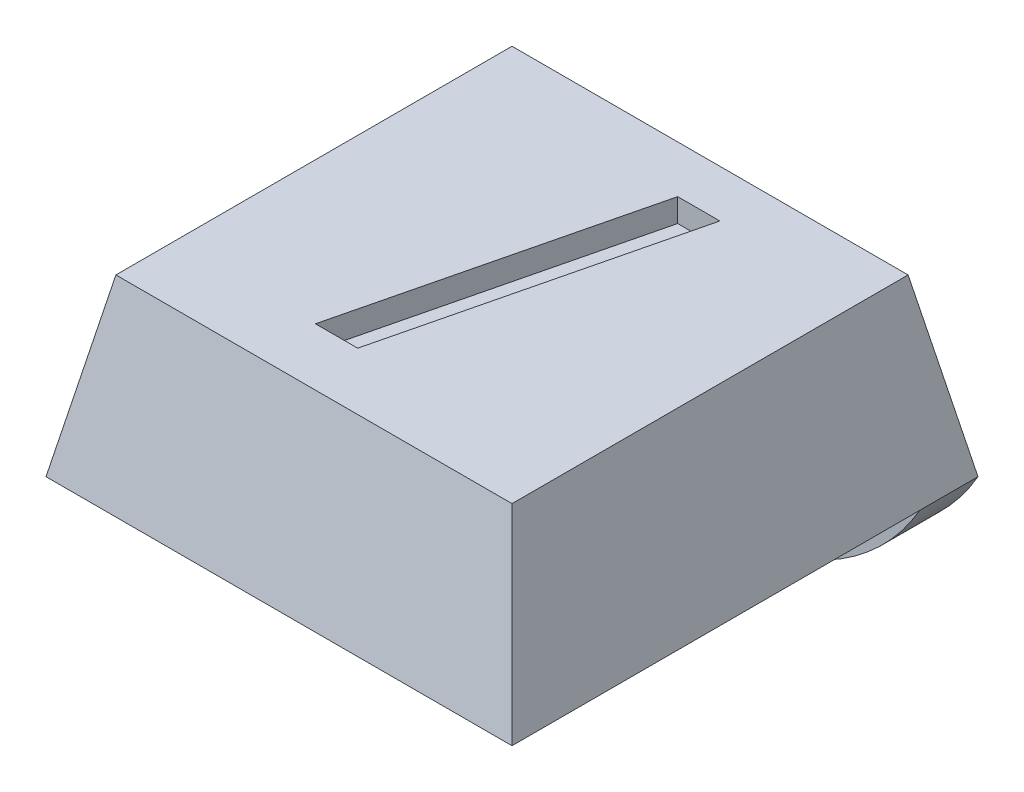
ISO-10303-21;
HEADER;
FILE_DESCRIPTION(('STEP AP214'),'2;1');
FILE_NAME('part.step','',(''),(''),'','','');
FILE_SCHEMA(('AUTOMOTIVE_DESIGN { 1 0 10303 214 1 1 1 1 }'));
ENDSEC;
DATA;
#1=APPLICATION_CONTEXT('core data for automotive mechanical design processes');
#2=APPLICATION_PROTOCOL_DEFINITION('international standard','automotive_design',2000,#1);
#3=PRODUCT_CONTEXT('',#1,'mechanical');
#4=PRODUCT('Part','Part','',(#3));
#5=PRODUCT_RELATED_PRODUCT_CATEGORY('part','',(#4));
#6=PRODUCT_DEFINITION_FORMATION('','',#4);
#7=PRODUCT_DEFINITION_CONTEXT('part definition',#1,'design');
#8=PRODUCT_DEFINITION('design','',#6,#7);
#9=PRODUCT_DEFINITION_SHAPE('','',#8);
#10=(LENGTH_UNIT() NAMED_UNIT(*) SI_UNIT(.MILLI.,.METRE.));
#11=(NAMED_UNIT(*) PLANE_ANGLE_UNIT() SI_UNIT($,.RADIAN.));
#12=(NAMED_UNIT(*) SI_UNIT($,.STERADIAN.) SOLID_ANGLE_UNIT());
#13=UNCERTAINTY_MEASURE_WITH_UNIT(LENGTH_MEASURE(1.E-05),#10,'distance_accuracy_value','');
#14=(GEOMETRIC_REPRESENTATION_CONTEXT(3) GLOBAL_UNCERTAINTY_ASSIGNED_CONTEXT((#13)) GLOBAL_UNIT_ASSIGNED_CONTEXT((#10,
#11,#12)) REPRESENTATION_CONTEXT('',''));
#15=CARTESIAN_POINT('',(0.,0.,0.));
#16=DIRECTION('',(0.,0.,1.));
#17=DIRECTION('',(1.,0.,0.));
#18=AXIS2_PLACEMENT_3D('',#15,#16,#17);
#19=CARTESIAN_POINT('',(0.,3.,0.));
#20=DIRECTION('',(0.,-1.,0.));
#21=DIRECTION('',(0.,0.,-1.));
#22=AXIS2_PLACEMENT_3D('',#19,#20,#21);
#23=PLANE('',#22);
#24=DIRECTION('',(-1.,0.,0.));
#25=VECTOR('',#24,1.);
#26=CARTESIAN_POINT('',(11.,3.,-0.6));
#27=LINE('',#26,#25);
#28=CARTESIAN_POINT('',(7.4,3.,-0.6));
#29=VERTEX_POINT('',#28);
#30=CARTESIAN_POINT('',(0.6,3.,-0.6));
#31=VERTEX_POINT('',#30);
#32=EDGE_CURVE('E181',#29,#31,#27,.T.);
#33=ORIENTED_EDGE('',*,*,#32,.F.);
#34=DIRECTION('',(0.,0.,1.));
#35=VECTOR('',#34,1.);
#36=CARTESIAN_POINT('',(7.4,3.,-8.));
#37=LINE('',#36,#35);
#38=CARTESIAN_POINT('',(7.4,3.,-7.4));
#39=VERTEX_POINT('',#38);
#40=EDGE_CURVE('E194',#39,#29,#37,.T.);
#41=ORIENTED_EDGE('',*,*,#40,.F.);
#42=DIRECTION('',(-1.,0.,0.));
#43=VECTOR('',#42,1.);
#44=CARTESIAN_POINT('',(11.,3.,-7.4));
#45=LINE('',#44,#43);
#46=CARTESIAN_POINT('',(0.599999999999999,3.,-7.4));
#47=VERTEX_POINT('',#46);
#48=EDGE_CURVE('E177',#39,#47,#45,.T.);
#49=ORIENTED_EDGE('',*,*,#48,.T.);
#50=DIRECTION('',(0.,0.,1.));
#51=VECTOR('',#50,1.);
#52=CARTESIAN_POINT('',(0.6,3.,-8.));
#53=LINE('',#52,#51);
#54=EDGE_CURVE('E197',#47,#31,#53,.T.);
#55=ORIENTED_EDGE('',*,*,#54,.T.);
#56=EDGE_LOOP('',(#33,#41,#49,#55));
#57=FACE_BOUND('',#56,.T.);
#58=DIRECTION('',(-1.,0.,0.));
#59=VECTOR('',#58,1.);
#60=CARTESIAN_POINT('',(3.76440167960569,3.,-1.58646920091357));
#61=LINE('',#60,#59);
#62=CARTESIAN_POINT('',(3.76440167960569,3.,-1.58646920091357));
#63=VERTEX_POINT('',#62);
#64=CARTESIAN_POINT('',(3.03924142319544,3.,-1.58646920091357));
#65=VERTEX_POINT('',#64);
#66=EDGE_CURVE('E59',#63,#65,#61,.T.);
#67=ORIENTED_EDGE('',*,*,#66,.T.);
#68=DIRECTION('',(0.23685313162707,0.,-0.9715454667891));
#69=VECTOR('',#68,1.);
#70=CARTESIAN_POINT('',(3.03924142319544,3.,-1.58646920091357));
#71=LINE('',#70,#69);
#72=CARTESIAN_POINT('',(4.25819174370826,3.,-6.58646920091357));
#73=VERTEX_POINT('',#72);
#74=EDGE_CURVE('E149',#65,#73,#71,.T.);
#75=ORIENTED_EDGE('',*,*,#74,.T.);
#76=DIRECTION('',(1.,0.,0.));
#77=VECTOR('',#76,1.);
#78=CARTESIAN_POINT('',(4.25819174370826,3.,-6.58646920091357));
#79=LINE('',#78,#77);
#80=CARTESIAN_POINT('',(4.98235039755441,3.,-6.58646920091357));
#81=VERTEX_POINT('',#80);
#82=EDGE_CURVE('E476',#73,#81,#79,.T.);
#83=ORIENTED_EDGE('',*,*,#82,.T.);
#84=DIRECTION('',(-0.23666941653505,0.,0.971590236301785));
#85=VECTOR('',#84,1.);
#86=CARTESIAN_POINT('',(4.98235039755441,3.,-6.58646920091357));
#87=LINE('',#86,#85);
#88=EDGE_CURVE('E145',#81,#63,#87,.T.);
#89=ORIENTED_EDGE('',*,*,#88,.T.);
#90=EDGE_LOOP('',(#67,#75,#83,#89));
#91=FACE_BOUND('',#90,.T.);
#92=ADVANCED_FACE('F43',(#57,#91),#23,.F.);
#93=CARTESIAN_POINT('',(8.,0.,-8.));
#94=DIRECTION('',(-0.98058067569092,-0.196116135138184,0.));
#95=DIRECTION('',(0.196116135138184,-0.98058067569092,0.));
#96=AXIS2_PLACEMENT_3D('',#93,#94,#95);
#97=PLANE('',#96);
#98=DIRECTION('',(-0.192450089729875,0.962250448649376,-0.192450089729875));
#99=VECTOR('',#98,1.);
#100=CARTESIAN_POINT('',(7.7037037037037,1.48148148148148,-0.296296296296296));
#101=LINE('',#100,#99);
#102=CARTESIAN_POINT('',(8.,0.,0.));
#103=VERTEX_POINT('',#102);
#104=EDGE_CURVE('E191',#103,#29,#101,.T.);
#105=ORIENTED_EDGE('',*,*,#104,.F.);
#106=DIRECTION('',(0.,0.,-1.));
#107=VECTOR('',#106,1.);
#108=CARTESIAN_POINT('',(8.,0.,0.));
#109=LINE('',#108,#107);
#110=CARTESIAN_POINT('',(8.,0.,-7.));
#111=VERTEX_POINT('',#110);
#112=EDGE_CURVE('E210',#103,#111,#109,.T.);
#113=ORIENTED_EDGE('',*,*,#112,.T.);
#114=DIRECTION('',(0.,0.,1.));
#115=VECTOR('',#114,1.);
#116=CARTESIAN_POINT('',(8.,0.,-8.));
#117=LINE('',#116,#115);
#118=CARTESIAN_POINT('',(8.,0.,-8.));
#119=VERTEX_POINT('',#118);
#120=EDGE_CURVE('E151',#119,#111,#117,.T.);
#121=ORIENTED_EDGE('',*,*,#120,.F.);
#122=DIRECTION('',(0.192450089729875,-0.962250448649376,-0.192450089729875));
#123=VECTOR('',#122,1.);
#124=CARTESIAN_POINT('',(8.,0.,-8.));
#125=LINE('',#124,#123);
#126=EDGE_CURVE('E184',#39,#119,#125,.T.);
#127=ORIENTED_EDGE('',*,*,#126,.F.);
#128=ORIENTED_EDGE('',*,*,#40,.T.);
#129=EDGE_LOOP('',(#105,#113,#121,#127,#128));
#130=FACE_BOUND('',#129,.T.);
#131=ADVANCED_FACE('F278',(#130),#97,.F.);
#132=CARTESIAN_POINT('',(0.,0.,-8.));
#133=DIRECTION('',(0.98058067569092,-0.196116135138184,0.));
#134=DIRECTION('',(0.196116135138184,0.98058067569092,0.));
#135=AXIS2_PLACEMENT_3D('',#132,#133,#134);
#136=PLANE('',#135);
#137=DIRECTION('',(-0.192450089729875,-0.962250448649376,0.192450089729875));
#138=VECTOR('',#137,1.);
#139=CARTESIAN_POINT('',(0.296296296296296,1.48148148148148,-0.296296296296296));
#140=LINE('',#139,#138);
#141=CARTESIAN_POINT('',(0.,0.,0.));
#142=VERTEX_POINT('',#141);
#143=EDGE_CURVE('E238',#31,#142,#140,.T.);
#144=ORIENTED_EDGE('',*,*,#143,.F.);
#145=ORIENTED_EDGE('',*,*,#54,.F.);
#146=DIRECTION('',(0.192450089729875,0.962250448649376,0.192450089729875));
#147=VECTOR('',#146,1.);
#148=CARTESIAN_POINT('',(0.,0.,-8.));
#149=LINE('',#148,#147);
#150=CARTESIAN_POINT('',(0.,0.,-8.));
#151=VERTEX_POINT('',#150);
#152=EDGE_CURVE('E209',#151,#47,#149,.T.);
#153=ORIENTED_EDGE('',*,*,#152,.F.);
#154=DIRECTION('',(0.,0.,1.));
#155=VECTOR('',#154,1.);
#156=CARTESIAN_POINT('',(0.,0.,0.));
#157=LINE('',#156,#155);
#158=CARTESIAN_POINT('',(0.,0.,-7.));
#159=VERTEX_POINT('',#158);
#160=EDGE_CURVE('E214',#151,#159,#157,.T.);
#161=ORIENTED_EDGE('',*,*,#160,.T.);
#162=EDGE_CURVE('E201',#159,#142,#157,.T.);
#163=ORIENTED_EDGE('',*,*,#162,.T.);
#164=EDGE_LOOP('',(#144,#145,#153,#161,#163));
#165=FACE_BOUND('',#164,.T.);
#166=ADVANCED_FACE('F262',(#165),#136,.F.);
#167=CARTESIAN_POINT('',(0.,0.,0.));
#168=DIRECTION('',(0.,-1.,0.));
#169=DIRECTION('',(0.,0.,-1.));
#170=AXIS2_PLACEMENT_3D('',#167,#168,#169);
#171=PLANE('',#170);
#172=DIRECTION('',(-1.,0.,0.));
#173=VECTOR('',#172,1.);
#174=CARTESIAN_POINT('',(0.,0.,-7.));
#175=LINE('',#174,#173);
#176=EDGE_CURVE('E157',#111,#159,#175,.T.);
#177=ORIENTED_EDGE('',*,*,#176,.F.);
#178=ORIENTED_EDGE('',*,*,#112,.F.);
#179=DIRECTION('',(1.,0.,0.));
#180=VECTOR('',#179,1.);
#181=CARTESIAN_POINT('',(0.,0.,0.));
#182=LINE('',#181,#180);
#183=EDGE_CURVE('E211',#142,#103,#182,.T.);
#184=ORIENTED_EDGE('',*,*,#183,.F.);
#185=ORIENTED_EDGE('',*,*,#162,.F.);
#186=EDGE_LOOP('',(#177,#178,#184,#185));
#187=FACE_BOUND('',#186,.T.);
#188=CARTESIAN_POINT('',(4.,0.,-3.75));
#189=DIRECTION('',(0.,-1.,0.));
#190=DIRECTION('',(0.,0.,-1.));
#191=AXIS2_PLACEMENT_3D('',#188,#189,#190);
#192=CIRCLE('',#191,1.75);
#193=CARTESIAN_POINT('',(4.,0.,-5.5));
#194=VERTEX_POINT('',#193);
#195=EDGE_CURVE('E169',#194,#194,#192,.T.);
#196=ORIENTED_EDGE('',*,*,#195,.F.);
#197=EDGE_LOOP('',(#196));
#198=FACE_BOUND('',#197,.T.);
#199=ADVANCED_FACE('F273',(#187,#198),#171,.T.);
#200=CARTESIAN_POINT('',(11.,3.,-7.4));
#201=DIRECTION('',(0.,0.196116135138184,-0.98058067569092));
#202=DIRECTION('',(0.,0.98058067569092,0.196116135138184));
#203=AXIS2_PLACEMENT_3D('',#200,#201,#202);
#204=PLANE('',#203);
#205=ORIENTED_EDGE('',*,*,#126,.T.);
#206=DIRECTION('',(-1.,0.,0.));
#207=VECTOR('',#206,1.);
#208=CARTESIAN_POINT('',(0.,0.,-8.));
#209=LINE('',#208,#207);
#210=EDGE_CURVE('E205',#119,#151,#209,.T.);
#211=ORIENTED_EDGE('',*,*,#210,.T.);
#212=ORIENTED_EDGE('',*,*,#152,.T.);
#213=ORIENTED_EDGE('',*,*,#48,.F.);
#214=EDGE_LOOP('',(#205,#211,#212,#213));
#215=FACE_BOUND('',#214,.T.);
#216=ADVANCED_FACE('F257',(#215),#204,.T.);
#217=CARTESIAN_POINT('',(11.,0.,0.));
#218=DIRECTION('',(0.,0.196116135138184,0.98058067569092));
#219=DIRECTION('',(0.,-0.98058067569092,0.196116135138184));
#220=AXIS2_PLACEMENT_3D('',#217,#218,#219);
#221=PLANE('',#220);
#222=ORIENTED_EDGE('',*,*,#104,.T.);
#223=ORIENTED_EDGE('',*,*,#32,.T.);
#224=ORIENTED_EDGE('',*,*,#143,.T.);
#225=ORIENTED_EDGE('',*,*,#183,.T.);
#226=EDGE_LOOP('',(#222,#223,#224,#225));
#227=FACE_BOUND('',#226,.T.);
#228=ADVANCED_FACE('F302',(#227),#221,.T.);
#229=CARTESIAN_POINT('',(4.,0.4,-3.75));
#230=DIRECTION('',(0.,-1.,0.));
#231=DIRECTION('',(0.,0.,-1.));
#232=AXIS2_PLACEMENT_3D('',#229,#230,#231);
#233=CYLINDRICAL_SURFACE('',#232,1.75);
#234=CARTESIAN_POINT('',(4.,0.4,-3.75));
#235=DIRECTION('',(0.,-1.,0.));
#236=DIRECTION('',(0.,0.,-1.));
#237=AXIS2_PLACEMENT_3D('',#234,#235,#236);
#238=CIRCLE('',#237,1.75);
#239=CARTESIAN_POINT('',(4.,0.4,-5.5));
#240=VERTEX_POINT('',#239);
#241=EDGE_CURVE('E173',#240,#240,#238,.T.);
#242=ORIENTED_EDGE('',*,*,#241,.F.);
#243=EDGE_LOOP('',(#242));
#244=FACE_BOUND('',#243,.T.);
#245=ORIENTED_EDGE('',*,*,#195,.T.);
#246=EDGE_LOOP('',(#245));
#247=FACE_BOUND('',#246,.T.);
#248=ADVANCED_FACE('F309',(#244,#247),#233,.F.);
#249=CARTESIAN_POINT('',(4.,0.4,-3.75));
#250=DIRECTION('',(0.,-1.,0.));
#251=DIRECTION('',(0.,0.,-1.));
#252=AXIS2_PLACEMENT_3D('',#249,#250,#251);
#253=PLANE('',#252);
#254=ORIENTED_EDGE('',*,*,#241,.T.);
#255=EDGE_LOOP('',(#254));
#256=FACE_BOUND('',#255,.T.);
#257=ADVANCED_FACE('F313',(#256),#253,.T.);
#258=CARTESIAN_POINT('',(0.,-2.,-8.));
#259=DIRECTION('',(0.,0.,1.));
#260=DIRECTION('',(1.,0.,0.));
#261=AXIS2_PLACEMENT_3D('',#258,#259,#260);
#262=PLANE('',#261);
#263=ORIENTED_EDGE('',*,*,#210,.F.);
#264=CARTESIAN_POINT('',(4.53589838486225,2.,-8.));
#265=DIRECTION('',(0.,0.,1.));
#266=DIRECTION('',(1.,0.,0.));
#267=AXIS2_PLACEMENT_3D('',#264,#265,#266);
#268=CIRCLE('',#267,4.);
#269=CARTESIAN_POINT('',(4.53589838486225,-2.,-8.));
#270=VERTEX_POINT('',#269);
#271=EDGE_CURVE('E11',#119,#270,#268,.F.);
#272=ORIENTED_EDGE('',*,*,#271,.T.);
#273=DIRECTION('',(1.,0.,0.));
#274=VECTOR('',#273,1.);
#275=CARTESIAN_POINT('',(0.,-2.,-8.));
#276=LINE('',#275,#274);
#277=CARTESIAN_POINT('',(3.46410161513775,-2.,-8.));
#278=VERTEX_POINT('',#277);
#279=EDGE_CURVE('E163',#278,#270,#276,.T.);
#280=ORIENTED_EDGE('',*,*,#279,.F.);
#281=CARTESIAN_POINT('',(3.46410161513775,2.,-8.));
#282=DIRECTION('',(0.,0.,1.));
#283=DIRECTION('',(1.,0.,0.));
#284=AXIS2_PLACEMENT_3D('',#281,#282,#283);
#285=CIRCLE('',#284,4.);
#286=EDGE_CURVE('E52',#278,#151,#285,.F.);
#287=ORIENTED_EDGE('',*,*,#286,.T.);
#288=EDGE_LOOP('',(#263,#272,#280,#287));
#289=FACE_BOUND('',#288,.T.);
#290=ADVANCED_FACE('F250',(#289),#262,.F.);
#291=CARTESIAN_POINT('',(0.,-2.,-7.));
#292=DIRECTION('',(0.,0.,-1.));
#293=DIRECTION('',(-1.,0.,0.));
#294=AXIS2_PLACEMENT_3D('',#291,#292,#293);
#295=PLANE('',#294);
#296=DIRECTION('',(-1.,0.,0.));
#297=VECTOR('',#296,1.);
#298=CARTESIAN_POINT('',(0.,-2.,-7.));
#299=LINE('',#298,#297);
#300=CARTESIAN_POINT('',(4.53589838486225,-2.,-7.));
#301=VERTEX_POINT('',#300);
#302=CARTESIAN_POINT('',(3.46410161513775,-2.,-7.));
#303=VERTEX_POINT('',#302);
#304=EDGE_CURVE('E167',#301,#303,#299,.T.);
#305=ORIENTED_EDGE('',*,*,#304,.F.);
#306=CARTESIAN_POINT('',(4.53589838486225,2.,-7.));
#307=DIRECTION('',(0.,0.,-1.));
#308=DIRECTION('',(-1.,0.,0.));
#309=AXIS2_PLACEMENT_3D('',#306,#307,#308);
#310=CIRCLE('',#309,4.);
#311=EDGE_CURVE('E244',#301,#111,#310,.F.);
#312=ORIENTED_EDGE('',*,*,#311,.T.);
#313=ORIENTED_EDGE('',*,*,#176,.T.);
#314=CARTESIAN_POINT('',(3.46410161513775,2.,-7.));
#315=DIRECTION('',(0.,0.,-1.));
#316=DIRECTION('',(-1.,0.,0.));
#317=AXIS2_PLACEMENT_3D('',#314,#315,#316);
#318=CIRCLE('',#317,4.);
#319=EDGE_CURVE('E67',#159,#303,#318,.F.);
#320=ORIENTED_EDGE('',*,*,#319,.T.);
#321=EDGE_LOOP('',(#305,#312,#313,#320));
#322=FACE_BOUND('',#321,.T.);
#323=ADVANCED_FACE('F268',(#322),#295,.F.);
#324=CARTESIAN_POINT('',(0.,-2.,0.));
#325=DIRECTION('',(0.,1.,0.));
#326=DIRECTION('',(0.,0.,1.));
#327=AXIS2_PLACEMENT_3D('',#324,#325,#326);
#328=PLANE('',#327);
#329=ORIENTED_EDGE('',*,*,#279,.T.);
#330=DIRECTION('',(0.,0.,1.));
#331=VECTOR('',#330,1.);
#332=CARTESIAN_POINT('',(4.53589838486225,-2.,0.));
#333=LINE('',#332,#331);
#334=EDGE_CURVE('E237',#270,#301,#333,.T.);
#335=ORIENTED_EDGE('',*,*,#334,.T.);
#336=ORIENTED_EDGE('',*,*,#304,.T.);
#337=DIRECTION('',(0.,0.,-1.));
#338=VECTOR('',#337,1.);
#339=CARTESIAN_POINT('',(3.46410161513775,-2.,0.));
#340=LINE('',#339,#338);
#341=EDGE_CURVE('E233',#303,#278,#340,.T.);
#342=ORIENTED_EDGE('',*,*,#341,.T.);
#343=EDGE_LOOP('',(#329,#335,#336,#342));
#344=FACE_BOUND('',#343,.T.);
#345=ADVANCED_FACE('F266',(#344),#328,.F.);
#346=CARTESIAN_POINT('',(4.53589838486225,2.,-8.));
#347=DIRECTION('',(0.,0.,1.));
#348=DIRECTION('',(1.,0.,0.));
#349=AXIS2_PLACEMENT_3D('',#346,#347,#348);
#350=CYLINDRICAL_SURFACE('',#349,4.);
#351=ORIENTED_EDGE('',*,*,#271,.F.);
#352=ORIENTED_EDGE('',*,*,#120,.T.);
#353=ORIENTED_EDGE('',*,*,#311,.F.);
#354=ORIENTED_EDGE('',*,*,#334,.F.);
#355=EDGE_LOOP('',(#351,#352,#353,#354));
#356=FACE_BOUND('',#355,.T.);
#357=ADVANCED_FACE('F279',(#356),#350,.T.);
#358=CARTESIAN_POINT('',(3.46410161513775,2.,-8.));
#359=DIRECTION('',(0.,0.,-1.));
#360=DIRECTION('',(-1.,0.,0.));
#361=AXIS2_PLACEMENT_3D('',#358,#359,#360);
#362=CYLINDRICAL_SURFACE('',#361,4.);
#363=ORIENTED_EDGE('',*,*,#319,.F.);
#364=ORIENTED_EDGE('',*,*,#160,.F.);
#365=ORIENTED_EDGE('',*,*,#286,.F.);
#366=ORIENTED_EDGE('',*,*,#341,.F.);
#367=EDGE_LOOP('',(#363,#364,#365,#366));
#368=FACE_BOUND('',#367,.T.);
#369=ADVANCED_FACE('F45',(#368),#362,.T.);
#370=CARTESIAN_POINT('',(3.76440167960569,2.6,-1.58646920091357));
#371=DIRECTION('',(0.,0.,-1.));
#372=DIRECTION('',(-1.,0.,0.));
#373=AXIS2_PLACEMENT_3D('',#370,#371,#372);
#374=PLANE('',#373);
#375=ORIENTED_EDGE('',*,*,#66,.F.);
#376=DIRECTION('',(0.,1.,0.));
#377=VECTOR('',#376,1.);
#378=CARTESIAN_POINT('',(3.76440167960569,2.6,-1.58646920091357));
#379=LINE('',#378,#377);
#380=CARTESIAN_POINT('',(3.76440167960569,2.6,-1.58646920091357));
#381=VERTEX_POINT('',#380);
#382=EDGE_CURVE('E143',#381,#63,#379,.T.);
#383=ORIENTED_EDGE('',*,*,#382,.F.);
#384=DIRECTION('',(-1.,0.,0.));
#385=VECTOR('',#384,1.);
#386=CARTESIAN_POINT('',(3.76440167960569,2.6,-1.58646920091357));
#387=LINE('',#386,#385);
#388=CARTESIAN_POINT('',(3.03924142319544,2.6,-1.58646920091357));
#389=VERTEX_POINT('',#388);
#390=EDGE_CURVE('E134',#381,#389,#387,.T.);
#391=ORIENTED_EDGE('',*,*,#390,.T.);
#392=DIRECTION('',(0.,1.,0.));
#393=VECTOR('',#392,1.);
#394=CARTESIAN_POINT('',(3.03924142319544,2.6,-1.58646920091357));
#395=LINE('',#394,#393);
#396=EDGE_CURVE('E142',#389,#65,#395,.T.);
#397=ORIENTED_EDGE('',*,*,#396,.T.);
#398=EDGE_LOOP('',(#375,#383,#391,#397));
#399=FACE_BOUND('',#398,.T.);
#400=ADVANCED_FACE('F141',(#399),#374,.T.);
#401=CARTESIAN_POINT('',(3.03924142319544,2.6,-1.58646920091357));
#402=DIRECTION('',(0.9715454667891,0.,0.23685313162707));
#403=DIRECTION('',(0.23685313162707,0.,-0.9715454667891));
#404=AXIS2_PLACEMENT_3D('',#401,#402,#403);
#405=PLANE('',#404);
#406=ORIENTED_EDGE('',*,*,#74,.F.);
#407=ORIENTED_EDGE('',*,*,#396,.F.);
#408=DIRECTION('',(0.23685313162707,0.,-0.9715454667891));
#409=VECTOR('',#408,1.);
#410=CARTESIAN_POINT('',(3.03924142319544,2.6,-1.58646920091357));
#411=LINE('',#410,#409);
#412=CARTESIAN_POINT('',(4.25819174370826,2.6,-6.58646920091357));
#413=VERTEX_POINT('',#412);
#414=EDGE_CURVE('E130',#389,#413,#411,.T.);
#415=ORIENTED_EDGE('',*,*,#414,.T.);
#416=DIRECTION('',(0.,1.,0.));
#417=VECTOR('',#416,1.);
#418=CARTESIAN_POINT('',(4.25819174370826,2.6,-6.58646920091357));
#419=LINE('',#418,#417);
#420=EDGE_CURVE('E152',#413,#73,#419,.T.);
#421=ORIENTED_EDGE('',*,*,#420,.T.);
#422=EDGE_LOOP('',(#406,#407,#415,#421));
#423=FACE_BOUND('',#422,.T.);
#424=ADVANCED_FACE('F147',(#423),#405,.T.);
#425=CARTESIAN_POINT('',(4.25819174370826,2.6,-6.58646920091357));
#426=DIRECTION('',(0.,0.,1.));
#427=DIRECTION('',(1.,0.,0.));
#428=AXIS2_PLACEMENT_3D('',#425,#426,#427);
#429=PLANE('',#428);
#430=ORIENTED_EDGE('',*,*,#82,.F.);
#431=ORIENTED_EDGE('',*,*,#420,.F.);
#432=DIRECTION('',(1.,0.,0.));
#433=VECTOR('',#432,1.);
#434=CARTESIAN_POINT('',(4.25819174370826,2.6,-6.58646920091357));
#435=LINE('',#434,#433);
#436=CARTESIAN_POINT('',(4.98235039755441,2.6,-6.58646920091357));
#437=VERTEX_POINT('',#436);
#438=EDGE_CURVE('E135',#413,#437,#435,.T.);
#439=ORIENTED_EDGE('',*,*,#438,.T.);
#440=DIRECTION('',(0.,1.,0.));
#441=VECTOR('',#440,1.);
#442=CARTESIAN_POINT('',(4.98235039755441,2.6,-6.58646920091357));
#443=LINE('',#442,#441);
#444=EDGE_CURVE('E159',#437,#81,#443,.T.);
#445=ORIENTED_EDGE('',*,*,#444,.T.);
#446=EDGE_LOOP('',(#430,#431,#439,#445));
#447=FACE_BOUND('',#446,.T.);
#448=ADVANCED_FACE('F326',(#447),#429,.T.);
#449=CARTESIAN_POINT('',(4.98235039755441,2.6,-6.58646920091357));
#450=DIRECTION('',(-0.971590236301785,0.,-0.23666941653505));
#451=DIRECTION('',(-0.23666941653505,0.,0.971590236301785));
#452=AXIS2_PLACEMENT_3D('',#449,#450,#451);
#453=PLANE('',#452);
#454=ORIENTED_EDGE('',*,*,#88,.F.);
#455=ORIENTED_EDGE('',*,*,#444,.F.);
#456=DIRECTION('',(-0.23666941653505,0.,0.971590236301785));
#457=VECTOR('',#456,1.);
#458=CARTESIAN_POINT('',(4.98235039755441,2.6,-6.58646920091357));
#459=LINE('',#458,#457);
#460=EDGE_CURVE('E486',#437,#381,#459,.T.);
#461=ORIENTED_EDGE('',*,*,#460,.T.);
#462=ORIENTED_EDGE('',*,*,#382,.T.);
#463=EDGE_LOOP('',(#454,#455,#461,#462));
#464=FACE_BOUND('',#463,.T.);
#465=ADVANCED_FACE('F329',(#464),#453,.T.);
#466=CARTESIAN_POINT('',(0.,2.6,0.));
#467=DIRECTION('',(0.,1.,0.));
#468=DIRECTION('',(0.,0.,1.));
#469=AXIS2_PLACEMENT_3D('',#466,#467,#468);
#470=PLANE('',#469);
#471=ORIENTED_EDGE('',*,*,#390,.F.);
#472=ORIENTED_EDGE('',*,*,#460,.F.);
#473=ORIENTED_EDGE('',*,*,#438,.F.);
#474=ORIENTED_EDGE('',*,*,#414,.F.);
#475=EDGE_LOOP('',(#471,#472,#473,#474));
#476=FACE_BOUND('',#475,.T.);
#477=ADVANCED_FACE('F132',(#476),#470,.T.);
#478=CLOSED_SHELL('',(#92,#131,#166,#199,#216,#228,#248,#257,#290,#323,#345,#357,#369,#400,#424,
#448,#465,#477));
#479=MANIFOLD_SOLID_BREP('B2',#478);
#480=ADVANCED_BREP_SHAPE_REPRESENTATION('',(#18,#479),#14);
#481=SHAPE_DEFINITION_REPRESENTATION(#9,#480);
ENDSEC;
END-ISO-10303-21;
